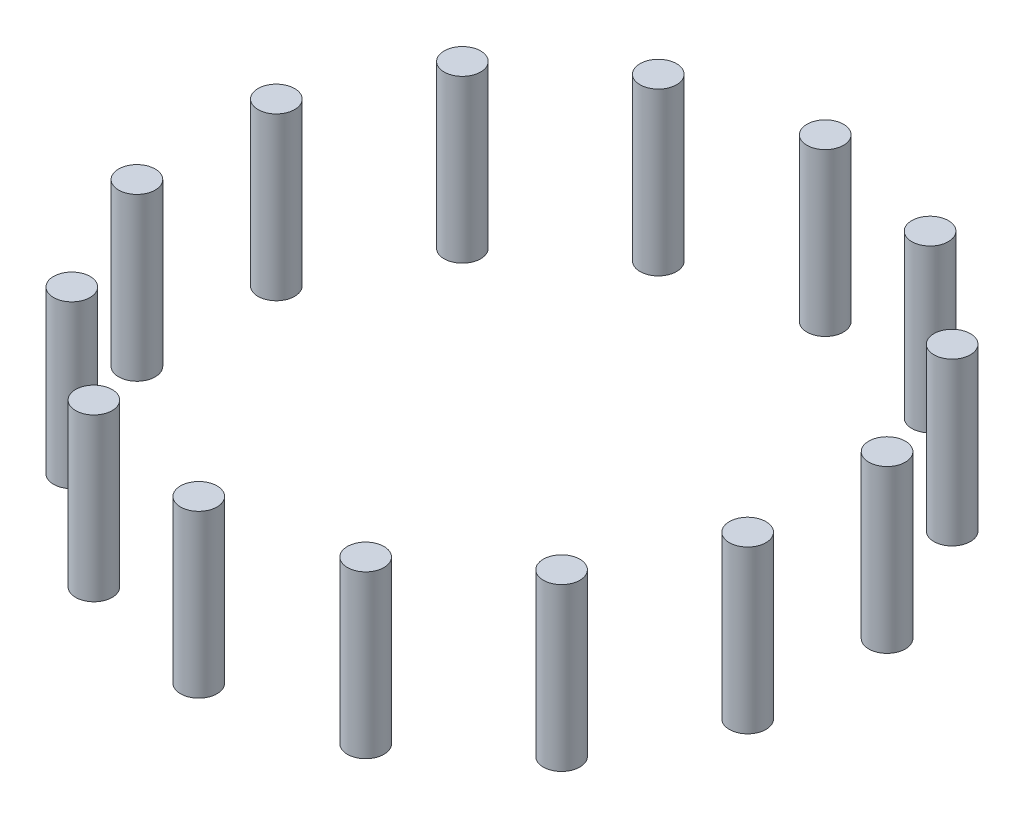
ISO-10303-21;
HEADER;
FILE_DESCRIPTION(('STEP AP214'),'2;1');
FILE_NAME('part.step','',(''),(''),'','','');
FILE_SCHEMA(('AUTOMOTIVE_DESIGN { 1 0 10303 214 1 1 1 1 }'));
ENDSEC;
DATA;
#1=APPLICATION_CONTEXT('core data for automotive mechanical design processes');
#2=APPLICATION_PROTOCOL_DEFINITION('international standard','automotive_design',2000,#1);
#3=PRODUCT_CONTEXT('',#1,'mechanical');
#4=PRODUCT('Part','Part','',(#3));
#5=PRODUCT_RELATED_PRODUCT_CATEGORY('part','',(#4));
#6=PRODUCT_DEFINITION_FORMATION('','',#4);
#7=PRODUCT_DEFINITION_CONTEXT('part definition',#1,'design');
#8=PRODUCT_DEFINITION('design','',#6,#7);
#9=PRODUCT_DEFINITION_SHAPE('','',#8);
#10=(LENGTH_UNIT() NAMED_UNIT(*) SI_UNIT(.MILLI.,.METRE.));
#11=(NAMED_UNIT(*) PLANE_ANGLE_UNIT() SI_UNIT($,.RADIAN.));
#12=(NAMED_UNIT(*) SI_UNIT($,.STERADIAN.) SOLID_ANGLE_UNIT());
#13=UNCERTAINTY_MEASURE_WITH_UNIT(LENGTH_MEASURE(1.E-05),#10,'distance_accuracy_value','');
#14=(GEOMETRIC_REPRESENTATION_CONTEXT(3) GLOBAL_UNCERTAINTY_ASSIGNED_CONTEXT((#13)) GLOBAL_UNIT_ASSIGNED_CONTEXT((#10,
#11,#12)) REPRESENTATION_CONTEXT('',''));
#15=CARTESIAN_POINT('',(0.,0.,0.));
#16=DIRECTION('',(0.,0.,1.));
#17=DIRECTION('',(1.,0.,0.));
#18=AXIS2_PLACEMENT_3D('',#15,#16,#17);
#19=CARTESIAN_POINT('',(2.60330243470528,3.1,5.40581320741455));
#20=DIRECTION('',(0.,-1.,0.));
#21=DIRECTION('',(0.,0.,-1.));
#22=AXIS2_PLACEMENT_3D('',#19,#20,#21);
#23=CYLINDRICAL_SURFACE('',#22,0.350000000000001);
#24=CARTESIAN_POINT('',(2.60330243470528,3.1,5.40581320741455));
#25=DIRECTION('',(0.,1.,0.));
#26=DIRECTION('',(0.,0.,1.));
#27=AXIS2_PLACEMENT_3D('',#24,#25,#26);
#28=CIRCLE('',#27,0.350000000000001);
#29=CARTESIAN_POINT('',(2.60330243470528,3.1,5.75581320741455));
#30=VERTEX_POINT('',#29);
#31=EDGE_CURVE('E11',#30,#30,#28,.T.);
#32=ORIENTED_EDGE('',*,*,#31,.F.);
#33=EDGE_LOOP('',(#32));
#34=FACE_BOUND('',#33,.T.);
#35=CARTESIAN_POINT('',(2.60330243470528,0.,5.40581320741455));
#36=DIRECTION('',(0.,1.,0.));
#37=DIRECTION('',(0.,0.,1.));
#38=AXIS2_PLACEMENT_3D('',#35,#36,#37);
#39=CIRCLE('',#38,0.350000000000001);
#40=CARTESIAN_POINT('',(2.60330243470528,0.,5.75581320741455));
#41=VERTEX_POINT('',#40);
#42=EDGE_CURVE('E42',#41,#41,#39,.T.);
#43=ORIENTED_EDGE('',*,*,#42,.T.);
#44=EDGE_LOOP('',(#43));
#45=FACE_BOUND('',#44,.T.);
#46=ADVANCED_FACE('F39',(#34,#45),#23,.T.);
#47=CARTESIAN_POINT('',(2.60330243470528,3.1,5.40581320741455));
#48=DIRECTION('',(0.,1.,0.));
#49=DIRECTION('',(0.,0.,1.));
#50=AXIS2_PLACEMENT_3D('',#47,#48,#49);
#51=PLANE('',#50);
#52=ORIENTED_EDGE('',*,*,#31,.T.);
#53=EDGE_LOOP('',(#52));
#54=FACE_BOUND('',#53,.T.);
#55=ADVANCED_FACE('F54',(#54),#51,.T.);
#56=CARTESIAN_POINT('',(2.60330243470528,0.,5.40581320741455));
#57=DIRECTION('',(0.,1.,0.));
#58=DIRECTION('',(0.,0.,1.));
#59=AXIS2_PLACEMENT_3D('',#56,#57,#58);
#60=PLANE('',#59);
#61=ORIENTED_EDGE('',*,*,#42,.F.);
#62=EDGE_LOOP('',(#61));
#63=FACE_BOUND('',#62,.T.);
#64=ADVANCED_FACE('F52',(#63),#60,.F.);
#65=CLOSED_SHELL('',(#46,#55,#64));
#66=MANIFOLD_SOLID_BREP('B2',#65);
#67=CARTESIAN_POINT('',(4.69098889480813,3.1,3.74093881115246));
#68=DIRECTION('',(0.,-1.,0.));
#69=DIRECTION('',(0.,0.,-1.));
#70=AXIS2_PLACEMENT_3D('',#67,#68,#69);
#71=CYLINDRICAL_SURFACE('',#70,0.35);
#72=CARTESIAN_POINT('',(4.69098889480813,3.1,3.74093881115246));
#73=DIRECTION('',(0.,1.,0.));
#74=DIRECTION('',(0.,0.,1.));
#75=AXIS2_PLACEMENT_3D('',#72,#73,#74);
#76=CIRCLE('',#75,0.35);
#77=CARTESIAN_POINT('',(4.69098889480813,3.1,4.09093881115246));
#78=VERTEX_POINT('',#77);
#79=EDGE_CURVE('E38',#78,#78,#76,.T.);
#80=ORIENTED_EDGE('',*,*,#79,.F.);
#81=EDGE_LOOP('',(#80));
#82=FACE_BOUND('',#81,.T.);
#83=CARTESIAN_POINT('',(4.69098889480813,0.,3.74093881115246));
#84=DIRECTION('',(0.,1.,0.));
#85=DIRECTION('',(0.,0.,1.));
#86=AXIS2_PLACEMENT_3D('',#83,#84,#85);
#87=CIRCLE('',#86,0.35);
#88=CARTESIAN_POINT('',(4.69098889480813,0.,4.09093881115246));
#89=VERTEX_POINT('',#88);
#90=EDGE_CURVE('E90',#89,#89,#87,.T.);
#91=ORIENTED_EDGE('',*,*,#90,.T.);
#92=EDGE_LOOP('',(#91));
#93=FACE_BOUND('',#92,.T.);
#94=ADVANCED_FACE('F87',(#82,#93),#71,.T.);
#95=CARTESIAN_POINT('',(4.69098889480813,3.1,3.74093881115246));
#96=DIRECTION('',(0.,1.,0.));
#97=DIRECTION('',(0.,0.,1.));
#98=AXIS2_PLACEMENT_3D('',#95,#96,#97);
#99=PLANE('',#98);
#100=ORIENTED_EDGE('',*,*,#79,.T.);
#101=EDGE_LOOP('',(#100));
#102=FACE_BOUND('',#101,.T.);
#103=ADVANCED_FACE('F102',(#102),#99,.T.);
#104=CARTESIAN_POINT('',(4.69098889480813,0.,3.74093881115246));
#105=DIRECTION('',(0.,1.,0.));
#106=DIRECTION('',(0.,0.,1.));
#107=AXIS2_PLACEMENT_3D('',#104,#105,#106);
#108=PLANE('',#107);
#109=ORIENTED_EDGE('',*,*,#90,.F.);
#110=EDGE_LOOP('',(#109));
#111=FACE_BOUND('',#110,.T.);
#112=ADVANCED_FACE('F100',(#111),#108,.F.);
#113=CLOSED_SHELL('',(#94,#103,#112));
#114=MANIFOLD_SOLID_BREP('B6',#113);
#115=CARTESIAN_POINT('',(5.84956747309088,3.1,1.3351256037378));
#116=DIRECTION('',(0.,-1.,0.));
#117=DIRECTION('',(0.,0.,-1.));
#118=AXIS2_PLACEMENT_3D('',#115,#116,#117);
#119=CYLINDRICAL_SURFACE('',#118,0.350000000000149);
#120=CARTESIAN_POINT('',(5.84956747309088,3.1,1.3351256037378));
#121=DIRECTION('',(0.,1.,0.));
#122=DIRECTION('',(0.,0.,1.));
#123=AXIS2_PLACEMENT_3D('',#120,#121,#122);
#124=CIRCLE('',#123,0.350000000000149);
#125=CARTESIAN_POINT('',(5.84956747309088,3.1,1.68512560373795));
#126=VERTEX_POINT('',#125);
#127=EDGE_CURVE('E86',#126,#126,#124,.T.);
#128=ORIENTED_EDGE('',*,*,#127,.F.);
#129=EDGE_LOOP('',(#128));
#130=FACE_BOUND('',#129,.T.);
#131=CARTESIAN_POINT('',(5.84956747309088,0.,1.3351256037378));
#132=DIRECTION('',(0.,1.,0.));
#133=DIRECTION('',(0.,0.,1.));
#134=AXIS2_PLACEMENT_3D('',#131,#132,#133);
#135=CIRCLE('',#134,0.350000000000149);
#136=CARTESIAN_POINT('',(5.84956747309088,0.,1.68512560373795));
#137=VERTEX_POINT('',#136);
#138=EDGE_CURVE('E138',#137,#137,#135,.T.);
#139=ORIENTED_EDGE('',*,*,#138,.T.);
#140=EDGE_LOOP('',(#139));
#141=FACE_BOUND('',#140,.T.);
#142=ADVANCED_FACE('F135',(#130,#141),#119,.T.);
#143=CARTESIAN_POINT('',(5.84956747309088,3.1,1.3351256037378));
#144=DIRECTION('',(0.,1.,0.));
#145=DIRECTION('',(0.,0.,1.));
#146=AXIS2_PLACEMENT_3D('',#143,#144,#145);
#147=PLANE('',#146);
#148=ORIENTED_EDGE('',*,*,#127,.T.);
#149=EDGE_LOOP('',(#148));
#150=FACE_BOUND('',#149,.T.);
#151=ADVANCED_FACE('F150',(#150),#147,.T.);
#152=CARTESIAN_POINT('',(5.84956747309088,0.,1.3351256037378));
#153=DIRECTION('',(0.,1.,0.));
#154=DIRECTION('',(0.,0.,1.));
#155=AXIS2_PLACEMENT_3D('',#152,#153,#154);
#156=PLANE('',#155);
#157=ORIENTED_EDGE('',*,*,#138,.F.);
#158=EDGE_LOOP('',(#157));
#159=FACE_BOUND('',#158,.T.);
#160=ADVANCED_FACE('F148',(#159),#156,.F.);
#161=CLOSED_SHELL('',(#142,#151,#160));
#162=MANIFOLD_SOLID_BREP('B33',#161);
#163=CARTESIAN_POINT('',(5.84956747309084,3.1,-1.33512560373797));
#164=DIRECTION('',(0.,-1.,0.));
#165=DIRECTION('',(0.,0.,-1.));
#166=AXIS2_PLACEMENT_3D('',#163,#164,#165);
#167=CYLINDRICAL_SURFACE('',#166,0.35000000000018);
#168=CARTESIAN_POINT('',(5.84956747309084,3.1,-1.33512560373797));
#169=DIRECTION('',(0.,1.,0.));
#170=DIRECTION('',(0.,0.,1.));
#171=AXIS2_PLACEMENT_3D('',#168,#169,#170);
#172=CIRCLE('',#171,0.35000000000018);
#173=CARTESIAN_POINT('',(5.84956747309084,3.1,-0.985125603737789));
#174=VERTEX_POINT('',#173);
#175=EDGE_CURVE('E134',#174,#174,#172,.T.);
#176=ORIENTED_EDGE('',*,*,#175,.F.);
#177=EDGE_LOOP('',(#176));
#178=FACE_BOUND('',#177,.T.);
#179=CARTESIAN_POINT('',(5.84956747309084,0.,-1.33512560373797));
#180=DIRECTION('',(0.,1.,0.));
#181=DIRECTION('',(0.,0.,1.));
#182=AXIS2_PLACEMENT_3D('',#179,#180,#181);
#183=CIRCLE('',#182,0.35000000000018);
#184=CARTESIAN_POINT('',(5.84956747309084,0.,-0.985125603737789));
#185=VERTEX_POINT('',#184);
#186=EDGE_CURVE('E186',#185,#185,#183,.T.);
#187=ORIENTED_EDGE('',*,*,#186,.T.);
#188=EDGE_LOOP('',(#187));
#189=FACE_BOUND('',#188,.T.);
#190=ADVANCED_FACE('F183',(#178,#189),#167,.T.);
#191=CARTESIAN_POINT('',(5.84956747309084,3.1,-1.33512560373797));
#192=DIRECTION('',(0.,1.,0.));
#193=DIRECTION('',(0.,0.,1.));
#194=AXIS2_PLACEMENT_3D('',#191,#192,#193);
#195=PLANE('',#194);
#196=ORIENTED_EDGE('',*,*,#175,.T.);
#197=EDGE_LOOP('',(#196));
#198=FACE_BOUND('',#197,.T.);
#199=ADVANCED_FACE('F198',(#198),#195,.T.);
#200=CARTESIAN_POINT('',(5.84956747309084,0.,-1.33512560373797));
#201=DIRECTION('',(0.,1.,0.));
#202=DIRECTION('',(0.,0.,1.));
#203=AXIS2_PLACEMENT_3D('',#200,#201,#202);
#204=PLANE('',#203);
#205=ORIENTED_EDGE('',*,*,#186,.F.);
#206=EDGE_LOOP('',(#205));
#207=FACE_BOUND('',#206,.T.);
#208=ADVANCED_FACE('F196',(#207),#204,.F.);
#209=CLOSED_SHELL('',(#190,#199,#208));
#210=MANIFOLD_SOLID_BREP('B81',#209);
#211=CARTESIAN_POINT('',(4.69098889480804,3.1,-3.74093881115247));
#212=DIRECTION('',(0.,-1.,0.));
#213=DIRECTION('',(0.,0.,-1.));
#214=AXIS2_PLACEMENT_3D('',#211,#212,#213);
#215=CYLINDRICAL_SURFACE('',#214,0.350000000000202);
#216=CARTESIAN_POINT('',(4.69098889480804,3.1,-3.74093881115247));
#217=DIRECTION('',(0.,1.,0.));
#218=DIRECTION('',(0.,0.,1.));
#219=AXIS2_PLACEMENT_3D('',#216,#217,#218);
#220=CIRCLE('',#219,0.350000000000202);
#221=CARTESIAN_POINT('',(4.69098889480804,3.1,-3.39093881115227));
#222=VERTEX_POINT('',#221);
#223=EDGE_CURVE('E182',#222,#222,#220,.T.);
#224=ORIENTED_EDGE('',*,*,#223,.F.);
#225=EDGE_LOOP('',(#224));
#226=FACE_BOUND('',#225,.T.);
#227=CARTESIAN_POINT('',(4.69098889480804,0.,-3.74093881115247));
#228=DIRECTION('',(0.,1.,0.));
#229=DIRECTION('',(0.,0.,1.));
#230=AXIS2_PLACEMENT_3D('',#227,#228,#229);
#231=CIRCLE('',#230,0.350000000000202);
#232=CARTESIAN_POINT('',(4.69098889480804,0.,-3.39093881115227));
#233=VERTEX_POINT('',#232);
#234=EDGE_CURVE('E234',#233,#233,#231,.T.);
#235=ORIENTED_EDGE('',*,*,#234,.T.);
#236=EDGE_LOOP('',(#235));
#237=FACE_BOUND('',#236,.T.);
#238=ADVANCED_FACE('F231',(#226,#237),#215,.T.);
#239=CARTESIAN_POINT('',(4.69098889480804,3.1,-3.74093881115247));
#240=DIRECTION('',(0.,1.,0.));
#241=DIRECTION('',(0.,0.,1.));
#242=AXIS2_PLACEMENT_3D('',#239,#240,#241);
#243=PLANE('',#242);
#244=ORIENTED_EDGE('',*,*,#223,.T.);
#245=EDGE_LOOP('',(#244));
#246=FACE_BOUND('',#245,.T.);
#247=ADVANCED_FACE('F246',(#246),#243,.T.);
#248=CARTESIAN_POINT('',(4.69098889480804,0.,-3.74093881115247));
#249=DIRECTION('',(0.,1.,0.));
#250=DIRECTION('',(0.,0.,1.));
#251=AXIS2_PLACEMENT_3D('',#248,#249,#250);
#252=PLANE('',#251);
#253=ORIENTED_EDGE('',*,*,#234,.F.);
#254=EDGE_LOOP('',(#253));
#255=FACE_BOUND('',#254,.T.);
#256=ADVANCED_FACE('F244',(#255),#252,.F.);
#257=CLOSED_SHELL('',(#238,#247,#256));
#258=MANIFOLD_SOLID_BREP('B129',#257);
#259=CARTESIAN_POINT('',(2.60330243470519,3.1,-5.40581320741455));
#260=DIRECTION('',(0.,-1.,0.));
#261=DIRECTION('',(0.,0.,-1.));
#262=AXIS2_PLACEMENT_3D('',#259,#260,#261);
#263=CYLINDRICAL_SURFACE('',#262,0.35000000000021);
#264=CARTESIAN_POINT('',(2.60330243470519,3.1,-5.40581320741455));
#265=DIRECTION('',(0.,1.,0.));
#266=DIRECTION('',(0.,0.,1.));
#267=AXIS2_PLACEMENT_3D('',#264,#265,#266);
#268=CIRCLE('',#267,0.35000000000021);
#269=CARTESIAN_POINT('',(2.60330243470519,3.1,-5.05581320741434));
#270=VERTEX_POINT('',#269);
#271=EDGE_CURVE('E230',#270,#270,#268,.T.);
#272=ORIENTED_EDGE('',*,*,#271,.F.);
#273=EDGE_LOOP('',(#272));
#274=FACE_BOUND('',#273,.T.);
#275=CARTESIAN_POINT('',(2.60330243470519,0.,-5.40581320741455));
#276=DIRECTION('',(0.,1.,0.));
#277=DIRECTION('',(0.,0.,1.));
#278=AXIS2_PLACEMENT_3D('',#275,#276,#277);
#279=CIRCLE('',#278,0.35000000000021);
#280=CARTESIAN_POINT('',(2.60330243470519,0.,-5.05581320741434));
#281=VERTEX_POINT('',#280);
#282=EDGE_CURVE('E282',#281,#281,#279,.T.);
#283=ORIENTED_EDGE('',*,*,#282,.T.);
#284=EDGE_LOOP('',(#283));
#285=FACE_BOUND('',#284,.T.);
#286=ADVANCED_FACE('F279',(#274,#285),#263,.T.);
#287=CARTESIAN_POINT('',(2.60330243470519,3.1,-5.40581320741455));
#288=DIRECTION('',(0.,1.,0.));
#289=DIRECTION('',(0.,0.,1.));
#290=AXIS2_PLACEMENT_3D('',#287,#288,#289);
#291=PLANE('',#290);
#292=ORIENTED_EDGE('',*,*,#271,.T.);
#293=EDGE_LOOP('',(#292));
#294=FACE_BOUND('',#293,.T.);
#295=ADVANCED_FACE('F294',(#294),#291,.T.);
#296=CARTESIAN_POINT('',(2.60330243470519,0.,-5.40581320741455));
#297=DIRECTION('',(0.,1.,0.));
#298=DIRECTION('',(0.,0.,1.));
#299=AXIS2_PLACEMENT_3D('',#296,#297,#298);
#300=PLANE('',#299);
#301=ORIENTED_EDGE('',*,*,#282,.F.);
#302=EDGE_LOOP('',(#301));
#303=FACE_BOUND('',#302,.T.);
#304=ADVANCED_FACE('F292',(#303),#300,.F.);
#305=CLOSED_SHELL('',(#286,#295,#304));
#306=MANIFOLD_SOLID_BREP('B177',#305);
#307=CARTESIAN_POINT('',(-1.68290030462896E-13,3.1,-6.));
#308=DIRECTION('',(0.,-1.,0.));
#309=DIRECTION('',(0.,0.,-1.));
#310=AXIS2_PLACEMENT_3D('',#307,#308,#309);
#311=CYLINDRICAL_SURFACE('',#310,0.350000000000202);
#312=CARTESIAN_POINT('',(-1.68290030462896E-13,3.1,-6.));
#313=DIRECTION('',(0.,1.,0.));
#314=DIRECTION('',(0.,0.,1.));
#315=AXIS2_PLACEMENT_3D('',#312,#313,#314);
#316=CIRCLE('',#315,0.350000000000202);
#317=CARTESIAN_POINT('',(-1.68290030462896E-13,3.1,-5.6499999999998));
#318=VERTEX_POINT('',#317);
#319=EDGE_CURVE('E278',#318,#318,#316,.T.);
#320=ORIENTED_EDGE('',*,*,#319,.F.);
#321=EDGE_LOOP('',(#320));
#322=FACE_BOUND('',#321,.T.);
#323=CARTESIAN_POINT('',(-1.68290030462896E-13,0.,-6.));
#324=DIRECTION('',(0.,1.,0.));
#325=DIRECTION('',(0.,0.,1.));
#326=AXIS2_PLACEMENT_3D('',#323,#324,#325);
#327=CIRCLE('',#326,0.350000000000202);
#328=CARTESIAN_POINT('',(-1.68290030462896E-13,0.,-5.6499999999998));
#329=VERTEX_POINT('',#328);
#330=EDGE_CURVE('E330',#329,#329,#327,.T.);
#331=ORIENTED_EDGE('',*,*,#330,.T.);
#332=EDGE_LOOP('',(#331));
#333=FACE_BOUND('',#332,.T.);
#334=ADVANCED_FACE('F327',(#322,#333),#311,.T.);
#335=CARTESIAN_POINT('',(-1.68290030462896E-13,3.1,-6.));
#336=DIRECTION('',(0.,1.,0.));
#337=DIRECTION('',(0.,0.,1.));
#338=AXIS2_PLACEMENT_3D('',#335,#336,#337);
#339=PLANE('',#338);
#340=ORIENTED_EDGE('',*,*,#319,.T.);
#341=EDGE_LOOP('',(#340));
#342=FACE_BOUND('',#341,.T.);
#343=ADVANCED_FACE('F342',(#342),#339,.T.);
#344=CARTESIAN_POINT('',(-1.68290030462896E-13,0.,-6.));
#345=DIRECTION('',(0.,1.,0.));
#346=DIRECTION('',(0.,0.,1.));
#347=AXIS2_PLACEMENT_3D('',#344,#345,#346);
#348=PLANE('',#347);
#349=ORIENTED_EDGE('',*,*,#330,.F.);
#350=EDGE_LOOP('',(#349));
#351=FACE_BOUND('',#350,.T.);
#352=ADVANCED_FACE('F340',(#351),#348,.F.);
#353=CLOSED_SHELL('',(#334,#343,#352));
#354=MANIFOLD_SOLID_BREP('B225',#353);
#355=CARTESIAN_POINT('',(-2.60330243470551,3.1,-5.40581320741448));
#356=DIRECTION('',(0.,-1.,0.));
#357=DIRECTION('',(0.,0.,-1.));
#358=AXIS2_PLACEMENT_3D('',#355,#356,#357);
#359=CYLINDRICAL_SURFACE('',#358,0.350000000000179);
#360=CARTESIAN_POINT('',(-2.60330243470551,3.1,-5.40581320741448));
#361=DIRECTION('',(0.,1.,0.));
#362=DIRECTION('',(0.,0.,1.));
#363=AXIS2_PLACEMENT_3D('',#360,#361,#362);
#364=CIRCLE('',#363,0.350000000000179);
#365=CARTESIAN_POINT('',(-2.60330243470551,3.1,-5.0558132074143));
#366=VERTEX_POINT('',#365);
#367=EDGE_CURVE('E326',#366,#366,#364,.T.);
#368=ORIENTED_EDGE('',*,*,#367,.F.);
#369=EDGE_LOOP('',(#368));
#370=FACE_BOUND('',#369,.T.);
#371=CARTESIAN_POINT('',(-2.60330243470551,0.,-5.40581320741448));
#372=DIRECTION('',(0.,1.,0.));
#373=DIRECTION('',(0.,0.,1.));
#374=AXIS2_PLACEMENT_3D('',#371,#372,#373);
#375=CIRCLE('',#374,0.350000000000179);
#376=CARTESIAN_POINT('',(-2.60330243470551,0.,-5.0558132074143));
#377=VERTEX_POINT('',#376);
#378=EDGE_CURVE('E378',#377,#377,#375,.T.);
#379=ORIENTED_EDGE('',*,*,#378,.T.);
#380=EDGE_LOOP('',(#379));
#381=FACE_BOUND('',#380,.T.);
#382=ADVANCED_FACE('F375',(#370,#381),#359,.T.);
#383=CARTESIAN_POINT('',(-2.60330243470551,3.1,-5.40581320741448));
#384=DIRECTION('',(0.,1.,0.));
#385=DIRECTION('',(0.,0.,1.));
#386=AXIS2_PLACEMENT_3D('',#383,#384,#385);
#387=PLANE('',#386);
#388=ORIENTED_EDGE('',*,*,#367,.T.);
#389=EDGE_LOOP('',(#388));
#390=FACE_BOUND('',#389,.T.);
#391=ADVANCED_FACE('F390',(#390),#387,.T.);
#392=CARTESIAN_POINT('',(-2.60330243470551,0.,-5.40581320741448));
#393=DIRECTION('',(0.,1.,0.));
#394=DIRECTION('',(0.,0.,1.));
#395=AXIS2_PLACEMENT_3D('',#392,#393,#394);
#396=PLANE('',#395);
#397=ORIENTED_EDGE('',*,*,#378,.F.);
#398=EDGE_LOOP('',(#397));
#399=FACE_BOUND('',#398,.T.);
#400=ADVANCED_FACE('F388',(#399),#396,.F.);
#401=CLOSED_SHELL('',(#382,#391,#400));
#402=MANIFOLD_SOLID_BREP('B273',#401);
#403=CARTESIAN_POINT('',(-4.69098889480831,3.1,-3.74093881115233));
#404=DIRECTION('',(0.,-1.,0.));
#405=DIRECTION('',(0.,0.,-1.));
#406=AXIS2_PLACEMENT_3D('',#403,#404,#405);
#407=CYLINDRICAL_SURFACE('',#406,0.350000000000139);
#408=CARTESIAN_POINT('',(-4.69098889480831,3.1,-3.74093881115233));
#409=DIRECTION('',(0.,1.,0.));
#410=DIRECTION('',(0.,0.,1.));
#411=AXIS2_PLACEMENT_3D('',#408,#409,#410);
#412=CIRCLE('',#411,0.350000000000139);
#413=CARTESIAN_POINT('',(-4.69098889480831,3.1,-3.3909388111522));
#414=VERTEX_POINT('',#413);
#415=EDGE_CURVE('E374',#414,#414,#412,.T.);
#416=ORIENTED_EDGE('',*,*,#415,.F.);
#417=EDGE_LOOP('',(#416));
#418=FACE_BOUND('',#417,.T.);
#419=CARTESIAN_POINT('',(-4.69098889480831,0.,-3.74093881115233));
#420=DIRECTION('',(0.,1.,0.));
#421=DIRECTION('',(0.,0.,1.));
#422=AXIS2_PLACEMENT_3D('',#419,#420,#421);
#423=CIRCLE('',#422,0.350000000000139);
#424=CARTESIAN_POINT('',(-4.69098889480831,0.,-3.3909388111522));
#425=VERTEX_POINT('',#424);
#426=EDGE_CURVE('E426',#425,#425,#423,.T.);
#427=ORIENTED_EDGE('',*,*,#426,.T.);
#428=EDGE_LOOP('',(#427));
#429=FACE_BOUND('',#428,.T.);
#430=ADVANCED_FACE('F423',(#418,#429),#407,.T.);
#431=CARTESIAN_POINT('',(-4.69098889480831,3.1,-3.74093881115233));
#432=DIRECTION('',(0.,1.,0.));
#433=DIRECTION('',(0.,0.,1.));
#434=AXIS2_PLACEMENT_3D('',#431,#432,#433);
#435=PLANE('',#434);
#436=ORIENTED_EDGE('',*,*,#415,.T.);
#437=EDGE_LOOP('',(#436));
#438=FACE_BOUND('',#437,.T.);
#439=ADVANCED_FACE('F438',(#438),#435,.T.);
#440=CARTESIAN_POINT('',(-4.69098889480831,0.,-3.74093881115233));
#441=DIRECTION('',(0.,1.,0.));
#442=DIRECTION('',(0.,0.,1.));
#443=AXIS2_PLACEMENT_3D('',#440,#441,#442);
#444=PLANE('',#443);
#445=ORIENTED_EDGE('',*,*,#426,.F.);
#446=EDGE_LOOP('',(#445));
#447=FACE_BOUND('',#446,.T.);
#448=ADVANCED_FACE('F436',(#447),#444,.F.);
#449=CLOSED_SHELL('',(#430,#439,#448));
#450=MANIFOLD_SOLID_BREP('B321',#449);
#451=CARTESIAN_POINT('',(-5.84956747309104,3.1,-1.3351256037378));
#452=DIRECTION('',(0.,-1.,0.));
#453=DIRECTION('',(0.,0.,-1.));
#454=AXIS2_PLACEMENT_3D('',#451,#452,#453);
#455=CYLINDRICAL_SURFACE('',#454,0.350000000000098);
#456=CARTESIAN_POINT('',(-5.84956747309104,3.1,-1.3351256037378));
#457=DIRECTION('',(0.,1.,0.));
#458=DIRECTION('',(0.,0.,1.));
#459=AXIS2_PLACEMENT_3D('',#456,#457,#458);
#460=CIRCLE('',#459,0.350000000000098);
#461=CARTESIAN_POINT('',(-5.84956747309104,3.1,-0.985125603737706));
#462=VERTEX_POINT('',#461);
#463=EDGE_CURVE('E422',#462,#462,#460,.T.);
#464=ORIENTED_EDGE('',*,*,#463,.F.);
#465=EDGE_LOOP('',(#464));
#466=FACE_BOUND('',#465,.T.);
#467=CARTESIAN_POINT('',(-5.84956747309104,0.,-1.3351256037378));
#468=DIRECTION('',(0.,1.,0.));
#469=DIRECTION('',(0.,0.,1.));
#470=AXIS2_PLACEMENT_3D('',#467,#468,#469);
#471=CIRCLE('',#470,0.350000000000098);
#472=CARTESIAN_POINT('',(-5.84956747309104,0.,-0.985125603737706));
#473=VERTEX_POINT('',#472);
#474=EDGE_CURVE('E474',#473,#473,#471,.T.);
#475=ORIENTED_EDGE('',*,*,#474,.T.);
#476=EDGE_LOOP('',(#475));
#477=FACE_BOUND('',#476,.T.);
#478=ADVANCED_FACE('F471',(#466,#477),#455,.T.);
#479=CARTESIAN_POINT('',(-5.84956747309104,3.1,-1.3351256037378));
#480=DIRECTION('',(0.,1.,0.));
#481=DIRECTION('',(0.,0.,1.));
#482=AXIS2_PLACEMENT_3D('',#479,#480,#481);
#483=PLANE('',#482);
#484=ORIENTED_EDGE('',*,*,#463,.T.);
#485=EDGE_LOOP('',(#484));
#486=FACE_BOUND('',#485,.T.);
#487=ADVANCED_FACE('F486',(#486),#483,.T.);
#488=CARTESIAN_POINT('',(-5.84956747309104,0.,-1.3351256037378));
#489=DIRECTION('',(0.,1.,0.));
#490=DIRECTION('',(0.,0.,1.));
#491=AXIS2_PLACEMENT_3D('',#488,#489,#490);
#492=PLANE('',#491);
#493=ORIENTED_EDGE('',*,*,#474,.F.);
#494=EDGE_LOOP('',(#493));
#495=FACE_BOUND('',#494,.T.);
#496=ADVANCED_FACE('F484',(#495),#492,.F.);
#497=CLOSED_SHELL('',(#478,#487,#496));
#498=MANIFOLD_SOLID_BREP('B369',#497);
#499=CARTESIAN_POINT('',(-5.84956747309094,3.1,1.33512560373787));
#500=DIRECTION('',(0.,-1.,0.));
#501=DIRECTION('',(0.,0.,-1.));
#502=AXIS2_PLACEMENT_3D('',#499,#500,#501);
#503=CYLINDRICAL_SURFACE('',#502,0.350000000000001);
#504=CARTESIAN_POINT('',(-5.84956747309094,3.1,1.33512560373787));
#505=DIRECTION('',(0.,1.,0.));
#506=DIRECTION('',(0.,0.,1.));
#507=AXIS2_PLACEMENT_3D('',#504,#505,#506);
#508=CIRCLE('',#507,0.350000000000001);
#509=CARTESIAN_POINT('',(-5.84956747309094,3.1,1.68512560373787));
#510=VERTEX_POINT('',#509);
#511=EDGE_CURVE('E470',#510,#510,#508,.T.);
#512=ORIENTED_EDGE('',*,*,#511,.F.);
#513=EDGE_LOOP('',(#512));
#514=FACE_BOUND('',#513,.T.);
#515=CARTESIAN_POINT('',(-5.84956747309094,0.,1.33512560373787));
#516=DIRECTION('',(0.,1.,0.));
#517=DIRECTION('',(0.,0.,1.));
#518=AXIS2_PLACEMENT_3D('',#515,#516,#517);
#519=CIRCLE('',#518,0.350000000000001);
#520=CARTESIAN_POINT('',(-5.84956747309094,0.,1.68512560373787));
#521=VERTEX_POINT('',#520);
#522=EDGE_CURVE('E522',#521,#521,#519,.T.);
#523=ORIENTED_EDGE('',*,*,#522,.T.);
#524=EDGE_LOOP('',(#523));
#525=FACE_BOUND('',#524,.T.);
#526=ADVANCED_FACE('F519',(#514,#525),#503,.T.);
#527=CARTESIAN_POINT('',(-5.84956747309094,3.1,1.33512560373787));
#528=DIRECTION('',(0.,1.,0.));
#529=DIRECTION('',(0.,0.,1.));
#530=AXIS2_PLACEMENT_3D('',#527,#528,#529);
#531=PLANE('',#530);
#532=ORIENTED_EDGE('',*,*,#511,.T.);
#533=EDGE_LOOP('',(#532));
#534=FACE_BOUND('',#533,.T.);
#535=ADVANCED_FACE('F534',(#534),#531,.T.);
#536=CARTESIAN_POINT('',(-5.84956747309094,0.,1.33512560373787));
#537=DIRECTION('',(0.,1.,0.));
#538=DIRECTION('',(0.,0.,1.));
#539=AXIS2_PLACEMENT_3D('',#536,#537,#538);
#540=PLANE('',#539);
#541=ORIENTED_EDGE('',*,*,#522,.F.);
#542=EDGE_LOOP('',(#541));
#543=FACE_BOUND('',#542,.T.);
#544=ADVANCED_FACE('F532',(#543),#540,.F.);
#545=CLOSED_SHELL('',(#526,#535,#544));
#546=MANIFOLD_SOLID_BREP('B417',#545);
#547=CARTESIAN_POINT('',(-4.69098889480819,3.1,3.74093881115239));
#548=DIRECTION('',(0.,-1.,0.));
#549=DIRECTION('',(0.,0.,-1.));
#550=AXIS2_PLACEMENT_3D('',#547,#548,#549);
#551=CYLINDRICAL_SURFACE('',#550,0.350000000000001);
#552=CARTESIAN_POINT('',(-4.69098889480819,3.1,3.74093881115239));
#553=DIRECTION('',(0.,1.,0.));
#554=DIRECTION('',(0.,0.,1.));
#555=AXIS2_PLACEMENT_3D('',#552,#553,#554);
#556=CIRCLE('',#555,0.350000000000001);
#557=CARTESIAN_POINT('',(-4.69098889480819,3.1,4.09093881115239));
#558=VERTEX_POINT('',#557);
#559=EDGE_CURVE('E518',#558,#558,#556,.T.);
#560=ORIENTED_EDGE('',*,*,#559,.F.);
#561=EDGE_LOOP('',(#560));
#562=FACE_BOUND('',#561,.T.);
#563=CARTESIAN_POINT('',(-4.69098889480819,0.,3.74093881115239));
#564=DIRECTION('',(0.,1.,0.));
#565=DIRECTION('',(0.,0.,1.));
#566=AXIS2_PLACEMENT_3D('',#563,#564,#565);
#567=CIRCLE('',#566,0.350000000000001);
#568=CARTESIAN_POINT('',(-4.69098889480819,0.,4.09093881115239));
#569=VERTEX_POINT('',#568);
#570=EDGE_CURVE('E570',#569,#569,#567,.T.);
#571=ORIENTED_EDGE('',*,*,#570,.T.);
#572=EDGE_LOOP('',(#571));
#573=FACE_BOUND('',#572,.T.);
#574=ADVANCED_FACE('F567',(#562,#573),#551,.T.);
#575=CARTESIAN_POINT('',(-4.69098889480819,3.1,3.74093881115239));
#576=DIRECTION('',(0.,1.,0.));
#577=DIRECTION('',(0.,0.,1.));
#578=AXIS2_PLACEMENT_3D('',#575,#576,#577);
#579=PLANE('',#578);
#580=ORIENTED_EDGE('',*,*,#559,.T.);
#581=EDGE_LOOP('',(#580));
#582=FACE_BOUND('',#581,.T.);
#583=ADVANCED_FACE('F582',(#582),#579,.T.);
#584=CARTESIAN_POINT('',(-4.69098889480819,0.,3.74093881115239));
#585=DIRECTION('',(0.,1.,0.));
#586=DIRECTION('',(0.,0.,1.));
#587=AXIS2_PLACEMENT_3D('',#584,#585,#586);
#588=PLANE('',#587);
#589=ORIENTED_EDGE('',*,*,#570,.F.);
#590=EDGE_LOOP('',(#589));
#591=FACE_BOUND('',#590,.T.);
#592=ADVANCED_FACE('F580',(#591),#588,.F.);
#593=CLOSED_SHELL('',(#574,#583,#592));
#594=MANIFOLD_SOLID_BREP('B465',#593);
#595=CARTESIAN_POINT('',(-2.60330243470535,3.1,5.40581320741451));
#596=DIRECTION('',(0.,-1.,0.));
#597=DIRECTION('',(0.,0.,-1.));
#598=AXIS2_PLACEMENT_3D('',#595,#596,#597);
#599=CYLINDRICAL_SURFACE('',#598,0.35);
#600=CARTESIAN_POINT('',(-2.60330243470535,3.1,5.40581320741451));
#601=DIRECTION('',(0.,1.,0.));
#602=DIRECTION('',(0.,0.,1.));
#603=AXIS2_PLACEMENT_3D('',#600,#601,#602);
#604=CIRCLE('',#603,0.35);
#605=CARTESIAN_POINT('',(-2.60330243470535,3.1,5.75581320741451));
#606=VERTEX_POINT('',#605);
#607=EDGE_CURVE('E566',#606,#606,#604,.T.);
#608=ORIENTED_EDGE('',*,*,#607,.F.);
#609=EDGE_LOOP('',(#608));
#610=FACE_BOUND('',#609,.T.);
#611=CARTESIAN_POINT('',(-2.60330243470535,0.,5.40581320741451));
#612=DIRECTION('',(0.,1.,0.));
#613=DIRECTION('',(0.,0.,1.));
#614=AXIS2_PLACEMENT_3D('',#611,#612,#613);
#615=CIRCLE('',#614,0.35);
#616=CARTESIAN_POINT('',(-2.60330243470535,0.,5.75581320741451));
#617=VERTEX_POINT('',#616);
#618=EDGE_CURVE('E617',#617,#617,#615,.T.);
#619=ORIENTED_EDGE('',*,*,#618,.T.);
#620=EDGE_LOOP('',(#619));
#621=FACE_BOUND('',#620,.T.);
#622=ADVANCED_FACE('F614',(#610,#621),#599,.T.);
#623=CARTESIAN_POINT('',(-2.60330243470535,3.1,5.40581320741451));
#624=DIRECTION('',(0.,1.,0.));
#625=DIRECTION('',(0.,0.,1.));
#626=AXIS2_PLACEMENT_3D('',#623,#624,#625);
#627=PLANE('',#626);
#628=ORIENTED_EDGE('',*,*,#607,.T.);
#629=EDGE_LOOP('',(#628));
#630=FACE_BOUND('',#629,.T.);
#631=ADVANCED_FACE('F629',(#630),#627,.T.);
#632=CARTESIAN_POINT('',(-2.60330243470535,0.,5.40581320741451));
#633=DIRECTION('',(0.,1.,0.));
#634=DIRECTION('',(0.,0.,1.));
#635=AXIS2_PLACEMENT_3D('',#632,#633,#634);
#636=PLANE('',#635);
#637=ORIENTED_EDGE('',*,*,#618,.F.);
#638=EDGE_LOOP('',(#637));
#639=FACE_BOUND('',#638,.T.);
#640=ADVANCED_FACE('F627',(#639),#636,.F.);
#641=CLOSED_SHELL('',(#622,#631,#640));
#642=MANIFOLD_SOLID_BREP('B513',#641);
#643=CARTESIAN_POINT('',(0.,3.1,6.));
#644=DIRECTION('',(0.,-1.,0.));
#645=DIRECTION('',(0.,0.,-1.));
#646=AXIS2_PLACEMENT_3D('',#643,#644,#645);
#647=CYLINDRICAL_SURFACE('',#646,0.35);
#648=CARTESIAN_POINT('',(0.,3.1,6.));
#649=DIRECTION('',(0.,1.,0.));
#650=DIRECTION('',(0.,0.,1.));
#651=AXIS2_PLACEMENT_3D('',#648,#649,#650);
#652=CIRCLE('',#651,0.35);
#653=CARTESIAN_POINT('',(0.,3.1,6.35));
#654=VERTEX_POINT('',#653);
#655=EDGE_CURVE('E613',#654,#654,#652,.T.);
#656=ORIENTED_EDGE('',*,*,#655,.F.);
#657=EDGE_LOOP('',(#656));
#658=FACE_BOUND('',#657,.T.);
#659=CARTESIAN_POINT('',(0.,0.,6.));
#660=DIRECTION('',(0.,1.,0.));
#661=DIRECTION('',(0.,0.,1.));
#662=AXIS2_PLACEMENT_3D('',#659,#660,#661);
#663=CIRCLE('',#662,0.35);
#664=CARTESIAN_POINT('',(0.,0.,6.35));
#665=VERTEX_POINT('',#664);
#666=EDGE_CURVE('E657',#665,#665,#663,.T.);
#667=ORIENTED_EDGE('',*,*,#666,.T.);
#668=EDGE_LOOP('',(#667));
#669=FACE_BOUND('',#668,.T.);
#670=ADVANCED_FACE('F654',(#658,#669),#647,.T.);
#671=CARTESIAN_POINT('',(0.,3.1,6.));
#672=DIRECTION('',(0.,1.,0.));
#673=DIRECTION('',(0.,0.,1.));
#674=AXIS2_PLACEMENT_3D('',#671,#672,#673);
#675=PLANE('',#674);
#676=ORIENTED_EDGE('',*,*,#655,.T.);
#677=EDGE_LOOP('',(#676));
#678=FACE_BOUND('',#677,.T.);
#679=ADVANCED_FACE('F669',(#678),#675,.T.);
#680=CARTESIAN_POINT('',(0.,0.,6.));
#681=DIRECTION('',(0.,1.,0.));
#682=DIRECTION('',(0.,0.,1.));
#683=AXIS2_PLACEMENT_3D('',#680,#681,#682);
#684=PLANE('',#683);
#685=ORIENTED_EDGE('',*,*,#666,.F.);
#686=EDGE_LOOP('',(#685));
#687=FACE_BOUND('',#686,.T.);
#688=ADVANCED_FACE('F667',(#687),#684,.F.);
#689=CLOSED_SHELL('',(#670,#679,#688));
#690=MANIFOLD_SOLID_BREP('B561',#689);
#691=ADVANCED_BREP_SHAPE_REPRESENTATION('',(#18,#66,#114,#162,#210,#258,#306,#354,#402,#450,
#498,#546,#594,#642,#690),#14);
#692=SHAPE_DEFINITION_REPRESENTATION(#9,#691);
ENDSEC;
END-ISO-10303-21;
